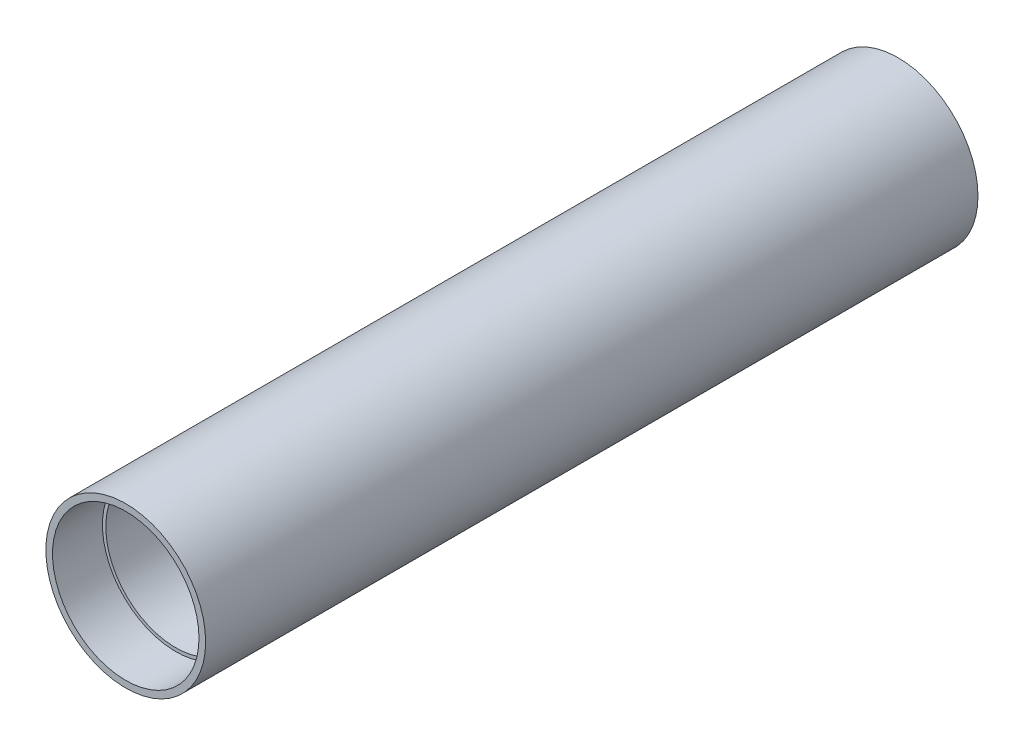
ISO-10303-21;
HEADER;
FILE_DESCRIPTION(('STEP AP214'),'2;1');
FILE_NAME('part.step','',(''),(''),'','','');
FILE_SCHEMA(('AUTOMOTIVE_DESIGN { 1 0 10303 214 1 1 1 1 }'));
ENDSEC;
DATA;
#1=APPLICATION_CONTEXT('core data for automotive mechanical design processes');
#2=APPLICATION_PROTOCOL_DEFINITION('international standard','automotive_design',2000,#1);
#3=PRODUCT_CONTEXT('',#1,'mechanical');
#4=PRODUCT('Part','Part','',(#3));
#5=PRODUCT_RELATED_PRODUCT_CATEGORY('part','',(#4));
#6=PRODUCT_DEFINITION_FORMATION('','',#4);
#7=PRODUCT_DEFINITION_CONTEXT('part definition',#1,'design');
#8=PRODUCT_DEFINITION('design','',#6,#7);
#9=PRODUCT_DEFINITION_SHAPE('','',#8);
#10=(LENGTH_UNIT() NAMED_UNIT(*) SI_UNIT(.MILLI.,.METRE.));
#11=(NAMED_UNIT(*) PLANE_ANGLE_UNIT() SI_UNIT($,.RADIAN.));
#12=(NAMED_UNIT(*) SI_UNIT($,.STERADIAN.) SOLID_ANGLE_UNIT());
#13=UNCERTAINTY_MEASURE_WITH_UNIT(LENGTH_MEASURE(1.E-05),#10,'distance_accuracy_value','');
#14=(GEOMETRIC_REPRESENTATION_CONTEXT(3) GLOBAL_UNCERTAINTY_ASSIGNED_CONTEXT((#13)) GLOBAL_UNIT_ASSIGNED_CONTEXT((#10,
#11,#12)) REPRESENTATION_CONTEXT('',''));
#15=CARTESIAN_POINT('',(0.,0.,0.));
#16=DIRECTION('',(0.,0.,1.));
#17=DIRECTION('',(1.,0.,0.));
#18=AXIS2_PLACEMENT_3D('',#15,#16,#17);
#19=CARTESIAN_POINT('',(0.,0.,1000.));
#20=DIRECTION('',(0.,0.,1.));
#21=DIRECTION('',(1.,0.,0.));
#22=AXIS2_PLACEMENT_3D('',#19,#20,#21);
#23=CYLINDRICAL_SURFACE('',#22,21.);
#24=CARTESIAN_POINT('',(0.,0.,101.));
#25=DIRECTION('',(0.,0.,1.));
#26=DIRECTION('',(1.,0.,0.));
#27=AXIS2_PLACEMENT_3D('',#24,#25,#26);
#28=CIRCLE('',#27,21.);
#29=CARTESIAN_POINT('',(21.,0.,101.));
#30=VERTEX_POINT('',#29);
#31=EDGE_CURVE('E10',#30,#30,#28,.T.);
#32=ORIENTED_EDGE('',*,*,#31,.T.);
#33=EDGE_LOOP('',(#32));
#34=FACE_BOUND('',#33,.T.);
#35=CARTESIAN_POINT('',(0.,0.,-101.));
#36=DIRECTION('',(0.,0.,1.));
#37=DIRECTION('',(1.,0.,0.));
#38=AXIS2_PLACEMENT_3D('',#35,#36,#37);
#39=CIRCLE('',#38,21.);
#40=CARTESIAN_POINT('',(21.,0.,-101.));
#41=VERTEX_POINT('',#40);
#42=EDGE_CURVE('E61',#41,#41,#39,.T.);
#43=ORIENTED_EDGE('',*,*,#42,.F.);
#44=EDGE_LOOP('',(#43));
#45=FACE_BOUND('',#44,.T.);
#46=ADVANCED_FACE('F36',(#34,#45),#23,.F.);
#47=CARTESIAN_POINT('',(0.,22.,101.));
#48=DIRECTION('',(0.,0.,-1.));
#49=DIRECTION('',(-1.,0.,0.));
#50=AXIS2_PLACEMENT_3D('',#47,#48,#49);
#51=PLANE('',#50);
#52=ORIENTED_EDGE('',*,*,#31,.F.);
#53=EDGE_LOOP('',(#52));
#54=FACE_BOUND('',#53,.T.);
#55=CARTESIAN_POINT('',(0.,0.,101.));
#56=DIRECTION('',(0.,0.,1.));
#57=DIRECTION('',(1.,0.,0.));
#58=AXIS2_PLACEMENT_3D('',#55,#56,#57);
#59=CIRCLE('',#58,22.);
#60=CARTESIAN_POINT('',(22.,0.,101.));
#61=VERTEX_POINT('',#60);
#62=EDGE_CURVE('E43',#61,#61,#59,.T.);
#63=ORIENTED_EDGE('',*,*,#62,.T.);
#64=EDGE_LOOP('',(#63));
#65=FACE_BOUND('',#64,.T.);
#66=ADVANCED_FACE('F93',(#54,#65),#51,.F.);
#67=CARTESIAN_POINT('',(0.,0.,1000.));
#68=DIRECTION('',(0.,0.,1.));
#69=DIRECTION('',(1.,0.,0.));
#70=AXIS2_PLACEMENT_3D('',#67,#68,#69);
#71=CYLINDRICAL_SURFACE('',#70,22.);
#72=ORIENTED_EDGE('',*,*,#62,.F.);
#73=EDGE_LOOP('',(#72));
#74=FACE_BOUND('',#73,.T.);
#75=CARTESIAN_POINT('',(0.,0.,116.));
#76=DIRECTION('',(0.,0.,1.));
#77=DIRECTION('',(1.,0.,0.));
#78=AXIS2_PLACEMENT_3D('',#75,#76,#77);
#79=CIRCLE('',#78,22.);
#80=CARTESIAN_POINT('',(22.,0.,116.));
#81=VERTEX_POINT('',#80);
#82=EDGE_CURVE('E49',#81,#81,#79,.T.);
#83=ORIENTED_EDGE('',*,*,#82,.T.);
#84=EDGE_LOOP('',(#83));
#85=FACE_BOUND('',#84,.T.);
#86=ADVANCED_FACE('F97',(#74,#85),#71,.F.);
#87=CARTESIAN_POINT('',(0.,24.,116.));
#88=DIRECTION('',(0.,0.,-1.));
#89=DIRECTION('',(-1.,0.,0.));
#90=AXIS2_PLACEMENT_3D('',#87,#88,#89);
#91=PLANE('',#90);
#92=ORIENTED_EDGE('',*,*,#82,.F.);
#93=EDGE_LOOP('',(#92));
#94=FACE_BOUND('',#93,.T.);
#95=CARTESIAN_POINT('',(0.,0.,116.));
#96=DIRECTION('',(0.,0.,1.));
#97=DIRECTION('',(1.,0.,0.));
#98=AXIS2_PLACEMENT_3D('',#95,#96,#97);
#99=CIRCLE('',#98,24.);
#100=CARTESIAN_POINT('',(24.,0.,116.));
#101=VERTEX_POINT('',#100);
#102=EDGE_CURVE('E55',#101,#101,#99,.T.);
#103=ORIENTED_EDGE('',*,*,#102,.T.);
#104=EDGE_LOOP('',(#103));
#105=FACE_BOUND('',#104,.T.);
#106=ADVANCED_FACE('F111',(#94,#105),#91,.F.);
#107=CARTESIAN_POINT('',(0.,0.,1000.));
#108=DIRECTION('',(0.,0.,1.));
#109=DIRECTION('',(1.,0.,0.));
#110=AXIS2_PLACEMENT_3D('',#107,#108,#109);
#111=CYLINDRICAL_SURFACE('',#110,24.);
#112=ORIENTED_EDGE('',*,*,#102,.F.);
#113=EDGE_LOOP('',(#112));
#114=FACE_BOUND('',#113,.T.);
#115=CARTESIAN_POINT('',(0.,0.,-116.));
#116=DIRECTION('',(0.,0.,1.));
#117=DIRECTION('',(1.,0.,0.));
#118=AXIS2_PLACEMENT_3D('',#115,#116,#117);
#119=CIRCLE('',#118,24.);
#120=CARTESIAN_POINT('',(24.,0.,-116.));
#121=VERTEX_POINT('',#120);
#122=EDGE_CURVE('E73',#121,#121,#119,.T.);
#123=ORIENTED_EDGE('',*,*,#122,.T.);
#124=EDGE_LOOP('',(#123));
#125=FACE_BOUND('',#124,.T.);
#126=ADVANCED_FACE('F79',(#114,#125),#111,.T.);
#127=CARTESIAN_POINT('',(0.,22.,-101.));
#128=DIRECTION('',(0.,0.,1.));
#129=DIRECTION('',(-1.,0.,0.));
#130=AXIS2_PLACEMENT_3D('',#127,#128,#129);
#131=PLANE('',#130);
#132=ORIENTED_EDGE('',*,*,#42,.T.);
#133=EDGE_LOOP('',(#132));
#134=FACE_BOUND('',#133,.T.);
#135=CARTESIAN_POINT('',(0.,0.,-101.));
#136=DIRECTION('',(0.,0.,1.));
#137=DIRECTION('',(1.,0.,0.));
#138=AXIS2_PLACEMENT_3D('',#135,#136,#137);
#139=CIRCLE('',#138,22.);
#140=CARTESIAN_POINT('',(22.,0.,-101.));
#141=VERTEX_POINT('',#140);
#142=EDGE_CURVE('E65',#141,#141,#139,.T.);
#143=ORIENTED_EDGE('',*,*,#142,.F.);
#144=EDGE_LOOP('',(#143));
#145=FACE_BOUND('',#144,.T.);
#146=ADVANCED_FACE('F89',(#134,#145),#131,.F.);
#147=CARTESIAN_POINT('',(0.,0.,-1000.));
#148=DIRECTION('',(0.,0.,-1.));
#149=DIRECTION('',(1.,0.,0.));
#150=AXIS2_PLACEMENT_3D('',#147,#148,#149);
#151=CYLINDRICAL_SURFACE('',#150,22.);
#152=ORIENTED_EDGE('',*,*,#142,.T.);
#153=EDGE_LOOP('',(#152));
#154=FACE_BOUND('',#153,.T.);
#155=CARTESIAN_POINT('',(0.,0.,-116.));
#156=DIRECTION('',(0.,0.,1.));
#157=DIRECTION('',(1.,0.,0.));
#158=AXIS2_PLACEMENT_3D('',#155,#156,#157);
#159=CIRCLE('',#158,22.);
#160=CARTESIAN_POINT('',(22.,0.,-116.));
#161=VERTEX_POINT('',#160);
#162=EDGE_CURVE('E69',#161,#161,#159,.T.);
#163=ORIENTED_EDGE('',*,*,#162,.F.);
#164=EDGE_LOOP('',(#163));
#165=FACE_BOUND('',#164,.T.);
#166=ADVANCED_FACE('F83',(#154,#165),#151,.F.);
#167=CARTESIAN_POINT('',(0.,24.,-116.));
#168=DIRECTION('',(0.,0.,1.));
#169=DIRECTION('',(-1.,0.,0.));
#170=AXIS2_PLACEMENT_3D('',#167,#168,#169);
#171=PLANE('',#170);
#172=ORIENTED_EDGE('',*,*,#162,.T.);
#173=EDGE_LOOP('',(#172));
#174=FACE_BOUND('',#173,.T.);
#175=ORIENTED_EDGE('',*,*,#122,.F.);
#176=EDGE_LOOP('',(#175));
#177=FACE_BOUND('',#176,.T.);
#178=ADVANCED_FACE('F81',(#174,#177),#171,.F.);
#179=CLOSED_SHELL('',(#46,#66,#86,#106,#126,#146,#166,#178));
#180=MANIFOLD_SOLID_BREP('B2',#179);
#181=ADVANCED_BREP_SHAPE_REPRESENTATION('',(#18,#180),#14);
#182=SHAPE_DEFINITION_REPRESENTATION(#9,#181);
ENDSEC;
END-ISO-10303-21;
